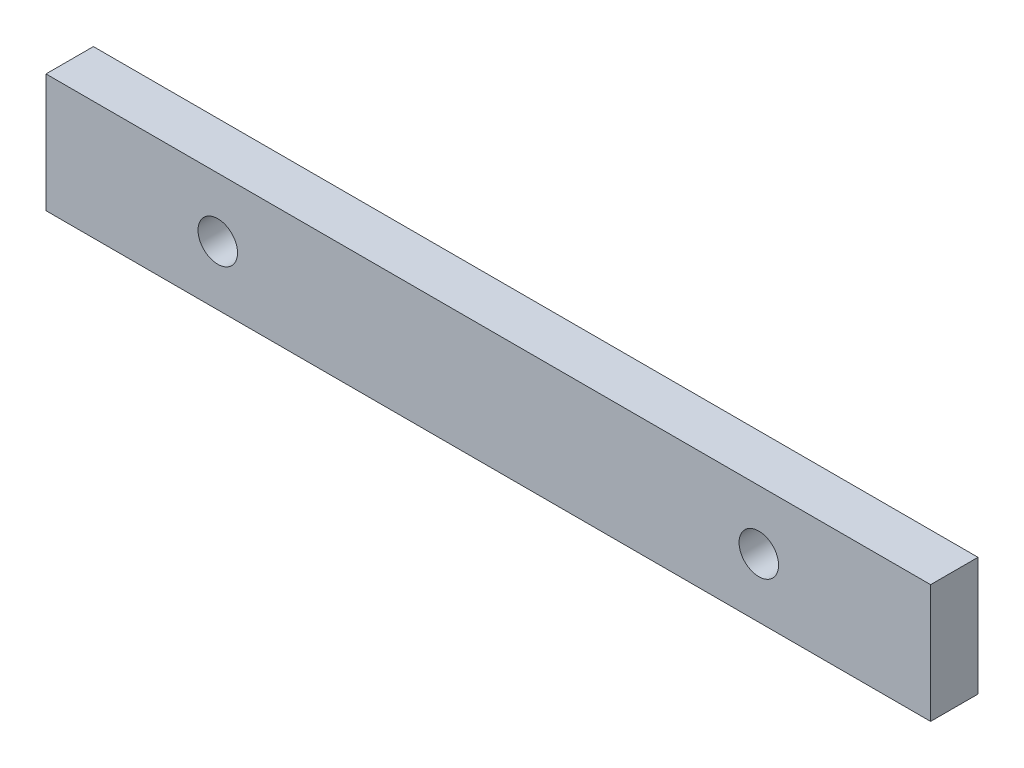
ISO-10303-21;
HEADER;
FILE_DESCRIPTION(('STEP AP214'),'2;1');
FILE_NAME('part.step','',(''),(''),'','','');
FILE_SCHEMA(('AUTOMOTIVE_DESIGN { 1 0 10303 214 1 1 1 1 }'));
ENDSEC;
DATA;
#1=APPLICATION_CONTEXT('core data for automotive mechanical design processes');
#2=APPLICATION_PROTOCOL_DEFINITION('international standard','automotive_design',2000,#1);
#3=PRODUCT_CONTEXT('',#1,'mechanical');
#4=PRODUCT('Part','Part','',(#3));
#5=PRODUCT_RELATED_PRODUCT_CATEGORY('part','',(#4));
#6=PRODUCT_DEFINITION_FORMATION('','',#4);
#7=PRODUCT_DEFINITION_CONTEXT('part definition',#1,'design');
#8=PRODUCT_DEFINITION('design','',#6,#7);
#9=PRODUCT_DEFINITION_SHAPE('','',#8);
#10=(LENGTH_UNIT() NAMED_UNIT(*) SI_UNIT(.MILLI.,.METRE.));
#11=(NAMED_UNIT(*) PLANE_ANGLE_UNIT() SI_UNIT($,.RADIAN.));
#12=(NAMED_UNIT(*) SI_UNIT($,.STERADIAN.) SOLID_ANGLE_UNIT());
#13=UNCERTAINTY_MEASURE_WITH_UNIT(LENGTH_MEASURE(1.E-05),#10,'distance_accuracy_value','');
#14=(GEOMETRIC_REPRESENTATION_CONTEXT(3) GLOBAL_UNCERTAINTY_ASSIGNED_CONTEXT((#13)) GLOBAL_UNIT_ASSIGNED_CONTEXT((#10,
#11,#12)) REPRESENTATION_CONTEXT('',''));
#15=CARTESIAN_POINT('',(0.,0.,0.));
#16=DIRECTION('',(0.,0.,1.));
#17=DIRECTION('',(1.,0.,0.));
#18=AXIS2_PLACEMENT_3D('',#15,#16,#17);
#19=CARTESIAN_POINT('',(224.,0.,12.));
#20=DIRECTION('',(-1.,0.,0.));
#21=DIRECTION('',(0.,1.,0.));
#22=AXIS2_PLACEMENT_3D('',#19,#20,#21);
#23=PLANE('',#22);
#24=DIRECTION('',(0.,0.,1.));
#25=VECTOR('',#24,1.);
#26=CARTESIAN_POINT('',(224.,0.,12.));
#27=LINE('',#26,#25);
#28=CARTESIAN_POINT('',(224.,0.,0.));
#29=VERTEX_POINT('',#28);
#30=CARTESIAN_POINT('',(224.,0.,12.));
#31=VERTEX_POINT('',#30);
#32=EDGE_CURVE('E11',#29,#31,#27,.T.);
#33=ORIENTED_EDGE('',*,*,#32,.F.);
#34=DIRECTION('',(0.,1.,0.));
#35=VECTOR('',#34,1.);
#36=CARTESIAN_POINT('',(224.,0.,0.));
#37=LINE('',#36,#35);
#38=CARTESIAN_POINT('',(224.,30.,0.));
#39=VERTEX_POINT('',#38);
#40=EDGE_CURVE('E102',#29,#39,#37,.T.);
#41=ORIENTED_EDGE('',*,*,#40,.T.);
#42=DIRECTION('',(0.,0.,1.));
#43=VECTOR('',#42,1.);
#44=CARTESIAN_POINT('',(224.,30.,12.));
#45=LINE('',#44,#43);
#46=CARTESIAN_POINT('',(224.,30.,12.));
#47=VERTEX_POINT('',#46);
#48=EDGE_CURVE('E57',#39,#47,#45,.T.);
#49=ORIENTED_EDGE('',*,*,#48,.T.);
#50=DIRECTION('',(0.,1.,0.));
#51=VECTOR('',#50,1.);
#52=CARTESIAN_POINT('',(224.,0.,12.));
#53=LINE('',#52,#51);
#54=EDGE_CURVE('E127',#31,#47,#53,.T.);
#55=ORIENTED_EDGE('',*,*,#54,.F.);
#56=EDGE_LOOP('',(#33,#41,#49,#55));
#57=FACE_BOUND('',#56,.T.);
#58=ADVANCED_FACE('F46',(#57),#23,.F.);
#59=CARTESIAN_POINT('',(0.,30.,12.));
#60=DIRECTION('',(0.,-1.,0.));
#61=DIRECTION('',(-1.,0.,0.));
#62=AXIS2_PLACEMENT_3D('',#59,#60,#61);
#63=PLANE('',#62);
#64=ORIENTED_EDGE('',*,*,#48,.F.);
#65=DIRECTION('',(-1.,0.,0.));
#66=VECTOR('',#65,1.);
#67=CARTESIAN_POINT('',(0.,30.,0.));
#68=LINE('',#67,#66);
#69=CARTESIAN_POINT('',(0.,30.,0.));
#70=VERTEX_POINT('',#69);
#71=EDGE_CURVE('E116',#39,#70,#68,.T.);
#72=ORIENTED_EDGE('',*,*,#71,.T.);
#73=DIRECTION('',(0.,0.,1.));
#74=VECTOR('',#73,1.);
#75=CARTESIAN_POINT('',(0.,30.,12.));
#76=LINE('',#75,#74);
#77=CARTESIAN_POINT('',(0.,30.,12.));
#78=VERTEX_POINT('',#77);
#79=EDGE_CURVE('E65',#70,#78,#76,.T.);
#80=ORIENTED_EDGE('',*,*,#79,.T.);
#81=DIRECTION('',(-1.,0.,0.));
#82=VECTOR('',#81,1.);
#83=CARTESIAN_POINT('',(0.,30.,12.));
#84=LINE('',#83,#82);
#85=EDGE_CURVE('E96',#47,#78,#84,.T.);
#86=ORIENTED_EDGE('',*,*,#85,.F.);
#87=EDGE_LOOP('',(#64,#72,#80,#86));
#88=FACE_BOUND('',#87,.T.);
#89=ADVANCED_FACE('F133',(#88),#63,.F.);
#90=CARTESIAN_POINT('',(0.,0.,12.));
#91=DIRECTION('',(1.,0.,0.));
#92=DIRECTION('',(0.,-1.,0.));
#93=AXIS2_PLACEMENT_3D('',#90,#91,#92);
#94=PLANE('',#93);
#95=ORIENTED_EDGE('',*,*,#79,.F.);
#96=DIRECTION('',(0.,1.,0.));
#97=VECTOR('',#96,1.);
#98=CARTESIAN_POINT('',(0.,0.,0.));
#99=LINE('',#98,#97);
#100=CARTESIAN_POINT('',(0.,0.,0.));
#101=VERTEX_POINT('',#100);
#102=EDGE_CURVE('E101',#70,#101,#99,.F.);
#103=ORIENTED_EDGE('',*,*,#102,.T.);
#104=DIRECTION('',(0.,0.,1.));
#105=VECTOR('',#104,1.);
#106=CARTESIAN_POINT('',(0.,0.,12.));
#107=LINE('',#106,#105);
#108=CARTESIAN_POINT('',(0.,0.,12.));
#109=VERTEX_POINT('',#108);
#110=EDGE_CURVE('E50',#101,#109,#107,.T.);
#111=ORIENTED_EDGE('',*,*,#110,.T.);
#112=DIRECTION('',(0.,-1.,0.));
#113=VECTOR('',#112,1.);
#114=CARTESIAN_POINT('',(0.,0.,12.));
#115=LINE('',#114,#113);
#116=EDGE_CURVE('E139',#78,#109,#115,.T.);
#117=ORIENTED_EDGE('',*,*,#116,.F.);
#118=EDGE_LOOP('',(#95,#103,#111,#117));
#119=FACE_BOUND('',#118,.T.);
#120=ADVANCED_FACE('F105',(#119),#94,.F.);
#121=CARTESIAN_POINT('',(43.5,15.,12.));
#122=DIRECTION('',(0.,0.,-1.));
#123=DIRECTION('',(-1.,0.,0.));
#124=AXIS2_PLACEMENT_3D('',#121,#122,#123);
#125=CYLINDRICAL_SURFACE('',#124,5.);
#126=CARTESIAN_POINT('',(43.5,15.,12.));
#127=DIRECTION('',(0.,0.,-1.));
#128=DIRECTION('',(-1.,0.,0.));
#129=AXIS2_PLACEMENT_3D('',#126,#127,#128);
#130=CIRCLE('',#129,5.);
#131=CARTESIAN_POINT('',(38.5,15.,12.));
#132=VERTEX_POINT('',#131);
#133=EDGE_CURVE('E119',#132,#132,#130,.T.);
#134=ORIENTED_EDGE('',*,*,#133,.F.);
#135=EDGE_LOOP('',(#134));
#136=FACE_BOUND('',#135,.T.);
#137=CARTESIAN_POINT('',(43.5,15.,0.));
#138=DIRECTION('',(0.,0.,-1.));
#139=DIRECTION('',(-1.,0.,0.));
#140=AXIS2_PLACEMENT_3D('',#137,#138,#139);
#141=CIRCLE('',#140,5.);
#142=CARTESIAN_POINT('',(38.5,15.,0.));
#143=VERTEX_POINT('',#142);
#144=EDGE_CURVE('E107',#143,#143,#141,.T.);
#145=ORIENTED_EDGE('',*,*,#144,.T.);
#146=EDGE_LOOP('',(#145));
#147=FACE_BOUND('',#146,.T.);
#148=ADVANCED_FACE('F167',(#136,#147),#125,.F.);
#149=CARTESIAN_POINT('',(0.,0.,12.));
#150=DIRECTION('',(0.,1.,0.));
#151=DIRECTION('',(1.,0.,0.));
#152=AXIS2_PLACEMENT_3D('',#149,#150,#151);
#153=PLANE('',#152);
#154=DIRECTION('',(-1.,0.,0.));
#155=VECTOR('',#154,1.);
#156=CARTESIAN_POINT('',(0.,0.,0.));
#157=LINE('',#156,#155);
#158=EDGE_CURVE('E89',#101,#29,#157,.F.);
#159=ORIENTED_EDGE('',*,*,#158,.T.);
#160=ORIENTED_EDGE('',*,*,#32,.T.);
#161=DIRECTION('',(1.,0.,0.));
#162=VECTOR('',#161,1.);
#163=CARTESIAN_POINT('',(0.,0.,12.));
#164=LINE('',#163,#162);
#165=EDGE_CURVE('E91',#109,#31,#164,.T.);
#166=ORIENTED_EDGE('',*,*,#165,.F.);
#167=ORIENTED_EDGE('',*,*,#110,.F.);
#168=EDGE_LOOP('',(#159,#160,#166,#167));
#169=FACE_BOUND('',#168,.T.);
#170=ADVANCED_FACE('F48',(#169),#153,.F.);
#171=CARTESIAN_POINT('',(0.,0.,12.));
#172=DIRECTION('',(0.,0.,-1.));
#173=DIRECTION('',(-1.,0.,0.));
#174=AXIS2_PLACEMENT_3D('',#171,#172,#173);
#175=PLANE('',#174);
#176=CARTESIAN_POINT('',(180.5,15.,12.));
#177=DIRECTION('',(0.,0.,-1.));
#178=DIRECTION('',(-1.,0.,0.));
#179=AXIS2_PLACEMENT_3D('',#176,#177,#178);
#180=CIRCLE('',#179,5.);
#181=CARTESIAN_POINT('',(175.5,15.,12.));
#182=VERTEX_POINT('',#181);
#183=EDGE_CURVE('E112',#182,#182,#180,.T.);
#184=ORIENTED_EDGE('',*,*,#183,.T.);
#185=EDGE_LOOP('',(#184));
#186=FACE_BOUND('',#185,.T.);
#187=ORIENTED_EDGE('',*,*,#133,.T.);
#188=EDGE_LOOP('',(#187));
#189=FACE_BOUND('',#188,.T.);
#190=ORIENTED_EDGE('',*,*,#116,.T.);
#191=ORIENTED_EDGE('',*,*,#165,.T.);
#192=ORIENTED_EDGE('',*,*,#54,.T.);
#193=ORIENTED_EDGE('',*,*,#85,.T.);
#194=EDGE_LOOP('',(#190,#191,#192,#193));
#195=FACE_BOUND('',#194,.T.);
#196=ADVANCED_FACE('F130',(#186,#189,#195),#175,.F.);
#197=CARTESIAN_POINT('',(0.,0.,0.));
#198=DIRECTION('',(0.,0.,-1.));
#199=DIRECTION('',(-1.,0.,0.));
#200=AXIS2_PLACEMENT_3D('',#197,#198,#199);
#201=PLANE('',#200);
#202=CARTESIAN_POINT('',(180.5,15.,0.));
#203=DIRECTION('',(0.,0.,1.));
#204=DIRECTION('',(1.,0.,0.));
#205=AXIS2_PLACEMENT_3D('',#202,#203,#204);
#206=CIRCLE('',#205,5.);
#207=CARTESIAN_POINT('',(185.5,15.,0.));
#208=VERTEX_POINT('',#207);
#209=EDGE_CURVE('E148',#208,#208,#206,.T.);
#210=ORIENTED_EDGE('',*,*,#209,.T.);
#211=EDGE_LOOP('',(#210));
#212=FACE_BOUND('',#211,.T.);
#213=ORIENTED_EDGE('',*,*,#144,.F.);
#214=EDGE_LOOP('',(#213));
#215=FACE_BOUND('',#214,.T.);
#216=ORIENTED_EDGE('',*,*,#102,.F.);
#217=ORIENTED_EDGE('',*,*,#71,.F.);
#218=ORIENTED_EDGE('',*,*,#40,.F.);
#219=ORIENTED_EDGE('',*,*,#158,.F.);
#220=EDGE_LOOP('',(#216,#217,#218,#219));
#221=FACE_BOUND('',#220,.T.);
#222=ADVANCED_FACE('F99',(#212,#215,#221),#201,.T.);
#223=CARTESIAN_POINT('',(180.5,15.,0.));
#224=DIRECTION('',(0.,0.,1.));
#225=DIRECTION('',(1.,0.,0.));
#226=AXIS2_PLACEMENT_3D('',#223,#224,#225);
#227=CYLINDRICAL_SURFACE('',#226,5.);
#228=ORIENTED_EDGE('',*,*,#209,.F.);
#229=EDGE_LOOP('',(#228));
#230=FACE_BOUND('',#229,.T.);
#231=ORIENTED_EDGE('',*,*,#183,.F.);
#232=EDGE_LOOP('',(#231));
#233=FACE_BOUND('',#232,.T.);
#234=ADVANCED_FACE('F156',(#230,#233),#227,.F.);
#235=CLOSED_SHELL('',(#58,#89,#120,#148,#170,#196,#222,#234));
#236=MANIFOLD_SOLID_BREP('B2',#235);
#237=ADVANCED_BREP_SHAPE_REPRESENTATION('',(#18,#236),#14);
#238=SHAPE_DEFINITION_REPRESENTATION(#9,#237);
ENDSEC;
END-ISO-10303-21;
